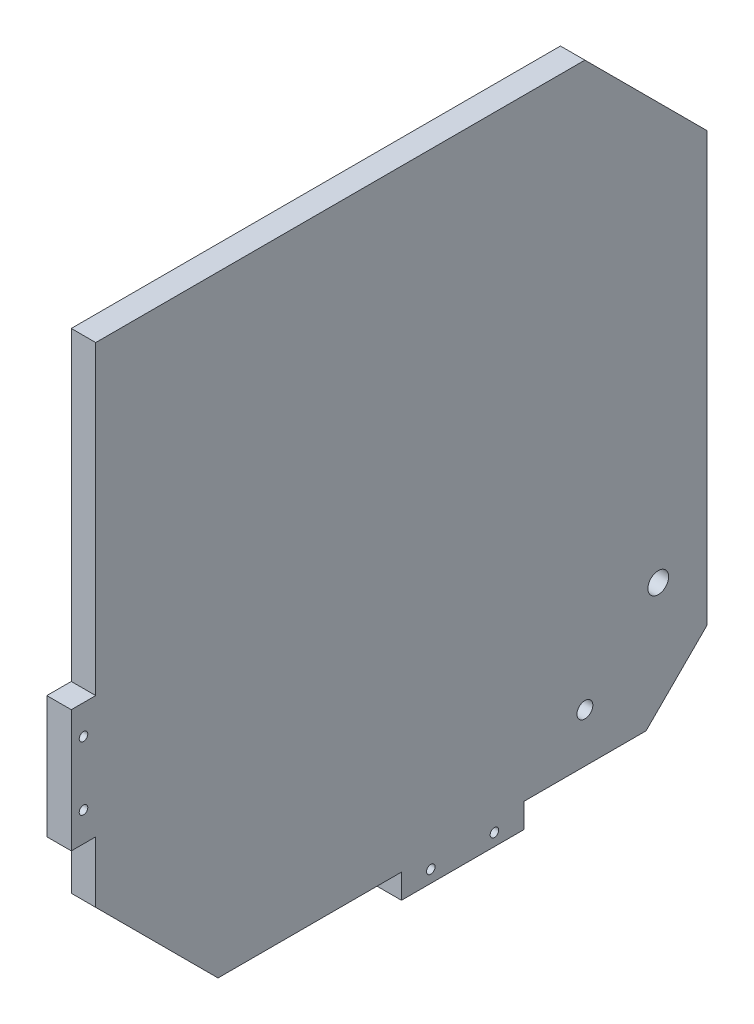
ISO-10303-21;
HEADER;
FILE_DESCRIPTION(('STEP AP214'),'2;1');
FILE_NAME('part.step','',(''),(''),'','','');
FILE_SCHEMA(('AUTOMOTIVE_DESIGN { 1 0 10303 214 1 1 1 1 }'));
ENDSEC;
DATA;
#1=APPLICATION_CONTEXT('core data for automotive mechanical design processes');
#2=APPLICATION_PROTOCOL_DEFINITION('international standard','automotive_design',2000,#1);
#3=PRODUCT_CONTEXT('',#1,'mechanical');
#4=PRODUCT('Part','Part','',(#3));
#5=PRODUCT_RELATED_PRODUCT_CATEGORY('part','',(#4));
#6=PRODUCT_DEFINITION_FORMATION('','',#4);
#7=PRODUCT_DEFINITION_CONTEXT('part definition',#1,'design');
#8=PRODUCT_DEFINITION('design','',#6,#7);
#9=PRODUCT_DEFINITION_SHAPE('','',#8);
#10=(LENGTH_UNIT() NAMED_UNIT(*) SI_UNIT(.MILLI.,.METRE.));
#11=(NAMED_UNIT(*) PLANE_ANGLE_UNIT() SI_UNIT($,.RADIAN.));
#12=(NAMED_UNIT(*) SI_UNIT($,.STERADIAN.) SOLID_ANGLE_UNIT());
#13=UNCERTAINTY_MEASURE_WITH_UNIT(LENGTH_MEASURE(1.E-05),#10,'distance_accuracy_value','');
#14=(GEOMETRIC_REPRESENTATION_CONTEXT(3) GLOBAL_UNCERTAINTY_ASSIGNED_CONTEXT((#13)) GLOBAL_UNIT_ASSIGNED_CONTEXT((#10,
#11,#12)) REPRESENTATION_CONTEXT('',''));
#15=CARTESIAN_POINT('',(0.,0.,0.));
#16=DIRECTION('',(0.,0.,1.));
#17=DIRECTION('',(1.,0.,0.));
#18=AXIS2_PLACEMENT_3D('',#15,#16,#17);
#19=CARTESIAN_POINT('',(10.,125.,0.));
#20=DIRECTION('',(-1.,0.,0.));
#21=DIRECTION('',(0.,0.,1.));
#22=AXIS2_PLACEMENT_3D('',#19,#20,#21);
#23=PLANE('',#22);
#24=CARTESIAN_POINT('',(10.,20.,-200.));
#25=DIRECTION('',(1.,0.,0.));
#26=DIRECTION('',(0.,0.,-1.));
#27=AXIS2_PLACEMENT_3D('',#24,#25,#26);
#28=CIRCLE('',#27,3.25000000000001);
#29=CARTESIAN_POINT('',(10.,20.,-203.25));
#30=VERTEX_POINT('',#29);
#31=EDGE_CURVE('E348',#30,#30,#28,.T.);
#32=ORIENTED_EDGE('',*,*,#31,.F.);
#33=EDGE_LOOP('',(#32));
#34=FACE_BOUND('',#33,.T.);
#35=CARTESIAN_POINT('',(10.,50.,-230.));
#36=DIRECTION('',(1.,0.,0.));
#37=DIRECTION('',(0.,0.,-1.));
#38=AXIS2_PLACEMENT_3D('',#35,#36,#37);
#39=CIRCLE('',#38,4.25000000000001);
#40=CARTESIAN_POINT('',(10.,50.,-234.25));
#41=VERTEX_POINT('',#40);
#42=EDGE_CURVE('E350',#41,#41,#39,.T.);
#43=ORIENTED_EDGE('',*,*,#42,.F.);
#44=EDGE_LOOP('',(#43));
#45=FACE_BOUND('',#44,.T.);
#46=CARTESIAN_POINT('',(10.,-5.,-137.));
#47=DIRECTION('',(1.,0.,0.));
#48=DIRECTION('',(0.,0.,-1.));
#49=AXIS2_PLACEMENT_3D('',#46,#47,#48);
#50=CIRCLE('',#49,1.75000000000001);
#51=CARTESIAN_POINT('',(10.,-5.,-138.75));
#52=VERTEX_POINT('',#51);
#53=EDGE_CURVE('E377',#52,#52,#50,.T.);
#54=ORIENTED_EDGE('',*,*,#53,.F.);
#55=EDGE_LOOP('',(#54));
#56=FACE_BOUND('',#55,.T.);
#57=CARTESIAN_POINT('',(10.,113.,4.99999999999998));
#58=DIRECTION('',(1.,0.,0.));
#59=DIRECTION('',(0.,0.,-1.));
#60=AXIS2_PLACEMENT_3D('',#57,#58,#59);
#61=CIRCLE('',#60,1.75);
#62=CARTESIAN_POINT('',(10.,113.,3.24999999999997));
#63=VERTEX_POINT('',#62);
#64=EDGE_CURVE('E173',#63,#63,#61,.T.);
#65=ORIENTED_EDGE('',*,*,#64,.F.);
#66=EDGE_LOOP('',(#65));
#67=FACE_BOUND('',#66,.T.);
#68=DIRECTION('',(0.,-1.,0.));
#69=VECTOR('',#68,1.);
#70=CARTESIAN_POINT('',(10.,250.,0.));
#71=LINE('',#70,#69);
#72=CARTESIAN_POINT('',(10.,250.,0.));
#73=VERTEX_POINT('',#72);
#74=CARTESIAN_POINT('',(10.,125.,0.));
#75=VERTEX_POINT('',#74);
#76=EDGE_CURVE('E198',#73,#75,#71,.T.);
#77=ORIENTED_EDGE('',*,*,#76,.T.);
#78=DIRECTION('',(0.,0.,1.));
#79=VECTOR('',#78,1.);
#80=CARTESIAN_POINT('',(10.,125.,0.));
#81=LINE('',#80,#79);
#82=CARTESIAN_POINT('',(10.,125.,9.99999999999999));
#83=VERTEX_POINT('',#82);
#84=EDGE_CURVE('E111',#75,#83,#81,.T.);
#85=ORIENTED_EDGE('',*,*,#84,.T.);
#86=DIRECTION('',(0.,-1.,0.));
#87=VECTOR('',#86,1.);
#88=CARTESIAN_POINT('',(10.,125.,9.99999999999999));
#89=LINE('',#88,#87);
#90=CARTESIAN_POINT('',(10.,75.,9.99999999999997));
#91=VERTEX_POINT('',#90);
#92=EDGE_CURVE('E234',#83,#91,#89,.T.);
#93=ORIENTED_EDGE('',*,*,#92,.T.);
#94=DIRECTION('',(0.,0.,-1.));
#95=VECTOR('',#94,1.);
#96=CARTESIAN_POINT('',(10.,75.,9.99999999999997));
#97=LINE('',#96,#95);
#98=CARTESIAN_POINT('',(10.,75.,0.));
#99=VERTEX_POINT('',#98);
#100=EDGE_CURVE('E253',#91,#99,#97,.T.);
#101=ORIENTED_EDGE('',*,*,#100,.T.);
#102=DIRECTION('',(0.,-1.,0.));
#103=VECTOR('',#102,1.);
#104=CARTESIAN_POINT('',(10.,75.,0.));
#105=LINE('',#104,#103);
#106=CARTESIAN_POINT('',(10.,50.,0.));
#107=VERTEX_POINT('',#106);
#108=EDGE_CURVE('E250',#99,#107,#105,.T.);
#109=ORIENTED_EDGE('',*,*,#108,.T.);
#110=DIRECTION('',(0.,-0.707106781186548,-0.707106781186547));
#111=VECTOR('',#110,1.);
#112=CARTESIAN_POINT('',(10.,50.,0.));
#113=LINE('',#112,#111);
#114=CARTESIAN_POINT('',(10.,0.,-50.));
#115=VERTEX_POINT('',#114);
#116=EDGE_CURVE('E252',#107,#115,#113,.T.);
#117=ORIENTED_EDGE('',*,*,#116,.T.);
#118=DIRECTION('',(0.,0.,-1.));
#119=VECTOR('',#118,1.);
#120=CARTESIAN_POINT('',(10.,0.,-50.));
#121=LINE('',#120,#119);
#122=CARTESIAN_POINT('',(10.,0.,-125.));
#123=VERTEX_POINT('',#122);
#124=EDGE_CURVE('E255',#115,#123,#121,.T.);
#125=ORIENTED_EDGE('',*,*,#124,.T.);
#126=DIRECTION('',(0.,-1.,0.));
#127=VECTOR('',#126,1.);
#128=CARTESIAN_POINT('',(10.,0.,-125.));
#129=LINE('',#128,#127);
#130=CARTESIAN_POINT('',(10.,-9.99999999999999,-125.));
#131=VERTEX_POINT('',#130);
#132=EDGE_CURVE('E261',#123,#131,#129,.T.);
#133=ORIENTED_EDGE('',*,*,#132,.T.);
#134=DIRECTION('',(0.,0.,-1.));
#135=VECTOR('',#134,1.);
#136=CARTESIAN_POINT('',(10.,-9.99999999999999,-125.));
#137=LINE('',#136,#135);
#138=CARTESIAN_POINT('',(10.,-9.99999999999999,-175.));
#139=VERTEX_POINT('',#138);
#140=EDGE_CURVE('E263',#131,#139,#137,.T.);
#141=ORIENTED_EDGE('',*,*,#140,.T.);
#142=DIRECTION('',(0.,1.,0.));
#143=VECTOR('',#142,1.);
#144=CARTESIAN_POINT('',(10.,-9.99999999999999,-175.));
#145=LINE('',#144,#143);
#146=CARTESIAN_POINT('',(10.,0.,-175.));
#147=VERTEX_POINT('',#146);
#148=EDGE_CURVE('E265',#139,#147,#145,.T.);
#149=ORIENTED_EDGE('',*,*,#148,.T.);
#150=DIRECTION('',(0.,0.,-1.));
#151=VECTOR('',#150,1.);
#152=CARTESIAN_POINT('',(10.,0.,-175.));
#153=LINE('',#152,#151);
#154=CARTESIAN_POINT('',(10.,0.,-225.));
#155=VERTEX_POINT('',#154);
#156=EDGE_CURVE('E267',#147,#155,#153,.T.);
#157=ORIENTED_EDGE('',*,*,#156,.T.);
#158=DIRECTION('',(0.,0.707106781186548,-0.707106781186547));
#159=VECTOR('',#158,1.);
#160=CARTESIAN_POINT('',(10.,25.,-250.));
#161=LINE('',#160,#159);
#162=CARTESIAN_POINT('',(10.,25.,-250.));
#163=VERTEX_POINT('',#162);
#164=EDGE_CURVE('E151',#155,#163,#161,.T.);
#165=ORIENTED_EDGE('',*,*,#164,.T.);
#166=DIRECTION('',(0.,1.,0.));
#167=VECTOR('',#166,1.);
#168=CARTESIAN_POINT('',(10.,200.,-250.));
#169=LINE('',#168,#167);
#170=CARTESIAN_POINT('',(10.,200.,-250.));
#171=VERTEX_POINT('',#170);
#172=EDGE_CURVE('E145',#163,#171,#169,.T.);
#173=ORIENTED_EDGE('',*,*,#172,.T.);
#174=DIRECTION('',(0.,0.707106781186547,0.707106781186548));
#175=VECTOR('',#174,1.);
#176=CARTESIAN_POINT('',(10.,250.,-200.));
#177=LINE('',#176,#175);
#178=CARTESIAN_POINT('',(10.,250.,-200.));
#179=VERTEX_POINT('',#178);
#180=EDGE_CURVE('E149',#171,#179,#177,.T.);
#181=ORIENTED_EDGE('',*,*,#180,.T.);
#182=DIRECTION('',(0.,0.,1.));
#183=VECTOR('',#182,1.);
#184=CARTESIAN_POINT('',(10.,250.,0.));
#185=LINE('',#184,#183);
#186=EDGE_CURVE('E47',#179,#73,#185,.T.);
#187=ORIENTED_EDGE('',*,*,#186,.T.);
#188=EDGE_LOOP('',(#77,#85,#93,#101,#109,#117,#125,#133,#141,#149,#157,#165,#173,#181,#187));
#189=FACE_BOUND('',#188,.T.);
#190=CARTESIAN_POINT('',(10.,87.,4.99999999999998));
#191=DIRECTION('',(1.,0.,0.));
#192=DIRECTION('',(0.,0.,-1.));
#193=AXIS2_PLACEMENT_3D('',#190,#191,#192);
#194=CIRCLE('',#193,1.75);
#195=CARTESIAN_POINT('',(10.,87.,3.24999999999997));
#196=VERTEX_POINT('',#195);
#197=EDGE_CURVE('E383',#196,#196,#194,.T.);
#198=ORIENTED_EDGE('',*,*,#197,.F.);
#199=EDGE_LOOP('',(#198));
#200=FACE_BOUND('',#199,.T.);
#201=CARTESIAN_POINT('',(10.,-5.,-163.));
#202=DIRECTION('',(1.,0.,0.));
#203=DIRECTION('',(0.,0.,-1.));
#204=AXIS2_PLACEMENT_3D('',#201,#202,#203);
#205=CIRCLE('',#204,1.75000000000001);
#206=CARTESIAN_POINT('',(10.,-5.,-164.75));
#207=VERTEX_POINT('',#206);
#208=EDGE_CURVE('E371',#207,#207,#205,.T.);
#209=ORIENTED_EDGE('',*,*,#208,.F.);
#210=EDGE_LOOP('',(#209));
#211=FACE_BOUND('',#210,.T.);
#212=ADVANCED_FACE('F30',(#34,#45,#56,#67,#189,#200,#211),#23,.F.);
#213=CARTESIAN_POINT('',(0.,125.,0.));
#214=DIRECTION('',(-1.,0.,0.));
#215=DIRECTION('',(0.,0.,1.));
#216=AXIS2_PLACEMENT_3D('',#213,#214,#215);
#217=PLANE('',#216);
#218=CARTESIAN_POINT('',(0.,20.,-200.));
#219=DIRECTION('',(1.,0.,0.));
#220=DIRECTION('',(0.,0.,-1.));
#221=AXIS2_PLACEMENT_3D('',#218,#219,#220);
#222=CIRCLE('',#221,3.25000000000001);
#223=CARTESIAN_POINT('',(0.,20.,-203.25));
#224=VERTEX_POINT('',#223);
#225=EDGE_CURVE('E346',#224,#224,#222,.T.);
#226=ORIENTED_EDGE('',*,*,#225,.T.);
#227=EDGE_LOOP('',(#226));
#228=FACE_BOUND('',#227,.T.);
#229=CARTESIAN_POINT('',(0.,50.,-230.));
#230=DIRECTION('',(1.,0.,0.));
#231=DIRECTION('',(0.,0.,-1.));
#232=AXIS2_PLACEMENT_3D('',#229,#230,#231);
#233=CIRCLE('',#232,4.25000000000001);
#234=CARTESIAN_POINT('',(0.,50.,-234.25));
#235=VERTEX_POINT('',#234);
#236=EDGE_CURVE('E353',#235,#235,#233,.T.);
#237=ORIENTED_EDGE('',*,*,#236,.T.);
#238=EDGE_LOOP('',(#237));
#239=FACE_BOUND('',#238,.T.);
#240=CARTESIAN_POINT('',(0.,-5.,-137.));
#241=DIRECTION('',(1.,0.,0.));
#242=DIRECTION('',(0.,0.,-1.));
#243=AXIS2_PLACEMENT_3D('',#240,#241,#242);
#244=CIRCLE('',#243,1.75000000000001);
#245=CARTESIAN_POINT('',(0.,-5.,-138.75));
#246=VERTEX_POINT('',#245);
#247=EDGE_CURVE('E374',#246,#246,#244,.T.);
#248=ORIENTED_EDGE('',*,*,#247,.T.);
#249=EDGE_LOOP('',(#248));
#250=FACE_BOUND('',#249,.T.);
#251=CARTESIAN_POINT('',(0.,113.,4.99999999999998));
#252=DIRECTION('',(1.,0.,0.));
#253=DIRECTION('',(0.,0.,-1.));
#254=AXIS2_PLACEMENT_3D('',#251,#252,#253);
#255=CIRCLE('',#254,1.75);
#256=CARTESIAN_POINT('',(0.,113.,3.24999999999997));
#257=VERTEX_POINT('',#256);
#258=EDGE_CURVE('E386',#257,#257,#255,.T.);
#259=ORIENTED_EDGE('',*,*,#258,.T.);
#260=EDGE_LOOP('',(#259));
#261=FACE_BOUND('',#260,.T.);
#262=DIRECTION('',(0.,-1.,0.));
#263=VECTOR('',#262,1.);
#264=CARTESIAN_POINT('',(0.,250.,0.));
#265=LINE('',#264,#263);
#266=CARTESIAN_POINT('',(0.,250.,0.));
#267=VERTEX_POINT('',#266);
#268=CARTESIAN_POINT('',(0.,125.,0.));
#269=VERTEX_POINT('',#268);
#270=EDGE_CURVE('E169',#267,#269,#265,.T.);
#271=ORIENTED_EDGE('',*,*,#270,.F.);
#272=DIRECTION('',(0.,0.,1.));
#273=VECTOR('',#272,1.);
#274=CARTESIAN_POINT('',(0.,250.,0.));
#275=LINE('',#274,#273);
#276=CARTESIAN_POINT('',(0.,250.,-200.));
#277=VERTEX_POINT('',#276);
#278=EDGE_CURVE('E103',#277,#267,#275,.T.);
#279=ORIENTED_EDGE('',*,*,#278,.F.);
#280=DIRECTION('',(0.,0.707106781186547,0.707106781186548));
#281=VECTOR('',#280,1.);
#282=CARTESIAN_POINT('',(0.,250.,-200.));
#283=LINE('',#282,#281);
#284=CARTESIAN_POINT('',(0.,200.,-250.));
#285=VERTEX_POINT('',#284);
#286=EDGE_CURVE('E97',#285,#277,#283,.T.);
#287=ORIENTED_EDGE('',*,*,#286,.F.);
#288=DIRECTION('',(0.,1.,0.));
#289=VECTOR('',#288,1.);
#290=CARTESIAN_POINT('',(0.,200.,-250.));
#291=LINE('',#290,#289);
#292=CARTESIAN_POINT('',(0.,25.,-250.));
#293=VERTEX_POINT('',#292);
#294=EDGE_CURVE('E159',#293,#285,#291,.T.);
#295=ORIENTED_EDGE('',*,*,#294,.F.);
#296=DIRECTION('',(0.,0.707106781186548,-0.707106781186547));
#297=VECTOR('',#296,1.);
#298=CARTESIAN_POINT('',(0.,25.,-250.));
#299=LINE('',#298,#297);
#300=CARTESIAN_POINT('',(0.,0.,-225.));
#301=VERTEX_POINT('',#300);
#302=EDGE_CURVE('E193',#301,#293,#299,.T.);
#303=ORIENTED_EDGE('',*,*,#302,.F.);
#304=DIRECTION('',(0.,0.,-1.));
#305=VECTOR('',#304,1.);
#306=CARTESIAN_POINT('',(0.,0.,-175.));
#307=LINE('',#306,#305);
#308=CARTESIAN_POINT('',(0.,0.,-175.));
#309=VERTEX_POINT('',#308);
#310=EDGE_CURVE('E191',#309,#301,#307,.T.);
#311=ORIENTED_EDGE('',*,*,#310,.F.);
#312=DIRECTION('',(0.,1.,0.));
#313=VECTOR('',#312,1.);
#314=CARTESIAN_POINT('',(0.,-9.99999999999999,-175.));
#315=LINE('',#314,#313);
#316=CARTESIAN_POINT('',(0.,-9.99999999999999,-175.));
#317=VERTEX_POINT('',#316);
#318=EDGE_CURVE('E189',#317,#309,#315,.T.);
#319=ORIENTED_EDGE('',*,*,#318,.F.);
#320=DIRECTION('',(0.,0.,-1.));
#321=VECTOR('',#320,1.);
#322=CARTESIAN_POINT('',(0.,-9.99999999999999,-125.));
#323=LINE('',#322,#321);
#324=CARTESIAN_POINT('',(0.,-9.99999999999999,-125.));
#325=VERTEX_POINT('',#324);
#326=EDGE_CURVE('E187',#325,#317,#323,.T.);
#327=ORIENTED_EDGE('',*,*,#326,.F.);
#328=DIRECTION('',(0.,-1.,0.));
#329=VECTOR('',#328,1.);
#330=CARTESIAN_POINT('',(0.,0.,-125.));
#331=LINE('',#330,#329);
#332=CARTESIAN_POINT('',(0.,0.,-125.));
#333=VERTEX_POINT('',#332);
#334=EDGE_CURVE('E185',#333,#325,#331,.T.);
#335=ORIENTED_EDGE('',*,*,#334,.F.);
#336=DIRECTION('',(0.,0.,-1.));
#337=VECTOR('',#336,1.);
#338=CARTESIAN_POINT('',(0.,0.,-50.));
#339=LINE('',#338,#337);
#340=CARTESIAN_POINT('',(0.,0.,-50.));
#341=VERTEX_POINT('',#340);
#342=EDGE_CURVE('E183',#341,#333,#339,.T.);
#343=ORIENTED_EDGE('',*,*,#342,.F.);
#344=DIRECTION('',(0.,-0.707106781186548,-0.707106781186547));
#345=VECTOR('',#344,1.);
#346=CARTESIAN_POINT('',(0.,50.,0.));
#347=LINE('',#346,#345);
#348=CARTESIAN_POINT('',(0.,50.,0.));
#349=VERTEX_POINT('',#348);
#350=EDGE_CURVE('E181',#349,#341,#347,.T.);
#351=ORIENTED_EDGE('',*,*,#350,.F.);
#352=DIRECTION('',(0.,-1.,0.));
#353=VECTOR('',#352,1.);
#354=CARTESIAN_POINT('',(0.,75.,0.));
#355=LINE('',#354,#353);
#356=CARTESIAN_POINT('',(0.,75.,0.));
#357=VERTEX_POINT('',#356);
#358=EDGE_CURVE('E179',#357,#349,#355,.T.);
#359=ORIENTED_EDGE('',*,*,#358,.F.);
#360=DIRECTION('',(0.,0.,-1.));
#361=VECTOR('',#360,1.);
#362=CARTESIAN_POINT('',(0.,75.,9.99999999999997));
#363=LINE('',#362,#361);
#364=CARTESIAN_POINT('',(0.,75.,9.99999999999997));
#365=VERTEX_POINT('',#364);
#366=EDGE_CURVE('E177',#365,#357,#363,.T.);
#367=ORIENTED_EDGE('',*,*,#366,.F.);
#368=DIRECTION('',(0.,-1.,0.));
#369=VECTOR('',#368,1.);
#370=CARTESIAN_POINT('',(0.,125.,9.99999999999999));
#371=LINE('',#370,#369);
#372=CARTESIAN_POINT('',(0.,125.,9.99999999999999));
#373=VERTEX_POINT('',#372);
#374=EDGE_CURVE('E175',#373,#365,#371,.T.);
#375=ORIENTED_EDGE('',*,*,#374,.F.);
#376=DIRECTION('',(0.,0.,1.));
#377=VECTOR('',#376,1.);
#378=CARTESIAN_POINT('',(0.,125.,0.));
#379=LINE('',#378,#377);
#380=EDGE_CURVE('E172',#269,#373,#379,.T.);
#381=ORIENTED_EDGE('',*,*,#380,.F.);
#382=EDGE_LOOP('',(#271,#279,#287,#295,#303,#311,#319,#327,#335,#343,#351,#359,#367,#375,#381));
#383=FACE_BOUND('',#382,.T.);
#384=CARTESIAN_POINT('',(0.,87.,4.99999999999998));
#385=DIRECTION('',(1.,0.,0.));
#386=DIRECTION('',(0.,0.,-1.));
#387=AXIS2_PLACEMENT_3D('',#384,#385,#386);
#388=CIRCLE('',#387,1.75);
#389=CARTESIAN_POINT('',(0.,87.,3.24999999999997));
#390=VERTEX_POINT('',#389);
#391=EDGE_CURVE('E380',#390,#390,#388,.T.);
#392=ORIENTED_EDGE('',*,*,#391,.T.);
#393=EDGE_LOOP('',(#392));
#394=FACE_BOUND('',#393,.T.);
#395=CARTESIAN_POINT('',(0.,-5.,-163.));
#396=DIRECTION('',(1.,0.,0.));
#397=DIRECTION('',(0.,0.,-1.));
#398=AXIS2_PLACEMENT_3D('',#395,#396,#397);
#399=CIRCLE('',#398,1.75000000000001);
#400=CARTESIAN_POINT('',(0.,-5.,-164.75));
#401=VERTEX_POINT('',#400);
#402=EDGE_CURVE('E368',#401,#401,#399,.T.);
#403=ORIENTED_EDGE('',*,*,#402,.T.);
#404=EDGE_LOOP('',(#403));
#405=FACE_BOUND('',#404,.T.);
#406=ADVANCED_FACE('F238',(#228,#239,#250,#261,#383,#394,#405),#217,.T.);
#407=CARTESIAN_POINT('',(10.,250.,0.));
#408=DIRECTION('',(0.,0.,-1.));
#409=DIRECTION('',(0.,1.,0.));
#410=AXIS2_PLACEMENT_3D('',#407,#408,#409);
#411=PLANE('',#410);
#412=ORIENTED_EDGE('',*,*,#270,.T.);
#413=DIRECTION('',(-1.,0.,0.));
#414=VECTOR('',#413,1.);
#415=CARTESIAN_POINT('',(10.,125.,0.));
#416=LINE('',#415,#414);
#417=EDGE_CURVE('E11',#75,#269,#416,.T.);
#418=ORIENTED_EDGE('',*,*,#417,.F.);
#419=ORIENTED_EDGE('',*,*,#76,.F.);
#420=DIRECTION('',(-1.,0.,0.));
#421=VECTOR('',#420,1.);
#422=CARTESIAN_POINT('',(10.,250.,0.));
#423=LINE('',#422,#421);
#424=EDGE_CURVE('E165',#73,#267,#423,.T.);
#425=ORIENTED_EDGE('',*,*,#424,.T.);
#426=EDGE_LOOP('',(#412,#418,#419,#425));
#427=FACE_BOUND('',#426,.T.);
#428=ADVANCED_FACE('F32',(#427),#411,.F.);
#429=CARTESIAN_POINT('',(10.,125.,0.));
#430=DIRECTION('',(0.,-1.,0.));
#431=DIRECTION('',(0.,0.,-1.));
#432=AXIS2_PLACEMENT_3D('',#429,#430,#431);
#433=PLANE('',#432);
#434=ORIENTED_EDGE('',*,*,#380,.T.);
#435=DIRECTION('',(-1.,0.,0.));
#436=VECTOR('',#435,1.);
#437=CARTESIAN_POINT('',(10.,125.,9.99999999999999));
#438=LINE('',#437,#436);
#439=EDGE_CURVE('E39',#83,#373,#438,.T.);
#440=ORIENTED_EDGE('',*,*,#439,.F.);
#441=ORIENTED_EDGE('',*,*,#84,.F.);
#442=ORIENTED_EDGE('',*,*,#417,.T.);
#443=EDGE_LOOP('',(#434,#440,#441,#442));
#444=FACE_BOUND('',#443,.T.);
#445=ADVANCED_FACE('F562',(#444),#433,.F.);
#446=CARTESIAN_POINT('',(10.,125.,9.99999999999999));
#447=DIRECTION('',(0.,0.,-1.));
#448=DIRECTION('',(0.,1.,0.));
#449=AXIS2_PLACEMENT_3D('',#446,#447,#448);
#450=PLANE('',#449);
#451=ORIENTED_EDGE('',*,*,#374,.T.);
#452=DIRECTION('',(-1.,0.,0.));
#453=VECTOR('',#452,1.);
#454=CARTESIAN_POINT('',(10.,75.,9.99999999999997));
#455=LINE('',#454,#453);
#456=EDGE_CURVE('E226',#91,#365,#455,.T.);
#457=ORIENTED_EDGE('',*,*,#456,.F.);
#458=ORIENTED_EDGE('',*,*,#92,.F.);
#459=ORIENTED_EDGE('',*,*,#439,.T.);
#460=EDGE_LOOP('',(#451,#457,#458,#459));
#461=FACE_BOUND('',#460,.T.);
#462=ADVANCED_FACE('F232',(#461),#450,.F.);
#463=CARTESIAN_POINT('',(10.,75.,9.99999999999997));
#464=DIRECTION('',(0.,1.,0.));
#465=DIRECTION('',(0.,0.,1.));
#466=AXIS2_PLACEMENT_3D('',#463,#464,#465);
#467=PLANE('',#466);
#468=ORIENTED_EDGE('',*,*,#366,.T.);
#469=DIRECTION('',(-1.,0.,0.));
#470=VECTOR('',#469,1.);
#471=CARTESIAN_POINT('',(10.,75.,0.));
#472=LINE('',#471,#470);
#473=EDGE_CURVE('E223',#99,#357,#472,.T.);
#474=ORIENTED_EDGE('',*,*,#473,.F.);
#475=ORIENTED_EDGE('',*,*,#100,.F.);
#476=ORIENTED_EDGE('',*,*,#456,.T.);
#477=EDGE_LOOP('',(#468,#474,#475,#476));
#478=FACE_BOUND('',#477,.T.);
#479=ADVANCED_FACE('F244',(#478),#467,.F.);
#480=CARTESIAN_POINT('',(10.,75.,0.));
#481=DIRECTION('',(0.,0.,-1.));
#482=DIRECTION('',(0.,1.,0.));
#483=AXIS2_PLACEMENT_3D('',#480,#481,#482);
#484=PLANE('',#483);
#485=ORIENTED_EDGE('',*,*,#358,.T.);
#486=DIRECTION('',(-1.,0.,0.));
#487=VECTOR('',#486,1.);
#488=CARTESIAN_POINT('',(10.,50.,0.));
#489=LINE('',#488,#487);
#490=EDGE_CURVE('E220',#107,#349,#489,.T.);
#491=ORIENTED_EDGE('',*,*,#490,.F.);
#492=ORIENTED_EDGE('',*,*,#108,.F.);
#493=ORIENTED_EDGE('',*,*,#473,.T.);
#494=EDGE_LOOP('',(#485,#491,#492,#493));
#495=FACE_BOUND('',#494,.T.);
#496=ADVANCED_FACE('F248',(#495),#484,.F.);
#497=CARTESIAN_POINT('',(10.,50.,0.));
#498=DIRECTION('',(0.,0.707106781186547,-0.707106781186548));
#499=DIRECTION('',(0.,0.707106781186548,0.707106781186547));
#500=AXIS2_PLACEMENT_3D('',#497,#498,#499);
#501=PLANE('',#500);
#502=ORIENTED_EDGE('',*,*,#350,.T.);
#503=DIRECTION('',(-1.,0.,0.));
#504=VECTOR('',#503,1.);
#505=CARTESIAN_POINT('',(10.,0.,-50.));
#506=LINE('',#505,#504);
#507=EDGE_CURVE('E217',#115,#341,#506,.T.);
#508=ORIENTED_EDGE('',*,*,#507,.F.);
#509=ORIENTED_EDGE('',*,*,#116,.F.);
#510=ORIENTED_EDGE('',*,*,#490,.T.);
#511=EDGE_LOOP('',(#502,#508,#509,#510));
#512=FACE_BOUND('',#511,.T.);
#513=ADVANCED_FACE('F527',(#512),#501,.F.);
#514=CARTESIAN_POINT('',(10.,0.,-50.));
#515=DIRECTION('',(0.,1.,0.));
#516=DIRECTION('',(0.,0.,1.));
#517=AXIS2_PLACEMENT_3D('',#514,#515,#516);
#518=PLANE('',#517);
#519=ORIENTED_EDGE('',*,*,#342,.T.);
#520=DIRECTION('',(-1.,0.,0.));
#521=VECTOR('',#520,1.);
#522=CARTESIAN_POINT('',(10.,0.,-125.));
#523=LINE('',#522,#521);
#524=EDGE_CURVE('E214',#123,#333,#523,.T.);
#525=ORIENTED_EDGE('',*,*,#524,.F.);
#526=ORIENTED_EDGE('',*,*,#124,.F.);
#527=ORIENTED_EDGE('',*,*,#507,.T.);
#528=EDGE_LOOP('',(#519,#525,#526,#527));
#529=FACE_BOUND('',#528,.T.);
#530=ADVANCED_FACE('F517',(#529),#518,.F.);
#531=CARTESIAN_POINT('',(10.,0.,-125.));
#532=DIRECTION('',(0.,0.,-1.));
#533=DIRECTION('',(-1.,0.,0.));
#534=AXIS2_PLACEMENT_3D('',#531,#532,#533);
#535=PLANE('',#534);
#536=ORIENTED_EDGE('',*,*,#334,.T.);
#537=DIRECTION('',(-1.,0.,0.));
#538=VECTOR('',#537,1.);
#539=CARTESIAN_POINT('',(10.,-9.99999999999999,-125.));
#540=LINE('',#539,#538);
#541=EDGE_CURVE('E211',#131,#325,#540,.T.);
#542=ORIENTED_EDGE('',*,*,#541,.F.);
#543=ORIENTED_EDGE('',*,*,#132,.F.);
#544=ORIENTED_EDGE('',*,*,#524,.T.);
#545=EDGE_LOOP('',(#536,#542,#543,#544));
#546=FACE_BOUND('',#545,.T.);
#547=ADVANCED_FACE('F507',(#546),#535,.F.);
#548=CARTESIAN_POINT('',(10.,-9.99999999999999,-125.));
#549=DIRECTION('',(0.,1.,0.));
#550=DIRECTION('',(0.,0.,1.));
#551=AXIS2_PLACEMENT_3D('',#548,#549,#550);
#552=PLANE('',#551);
#553=ORIENTED_EDGE('',*,*,#326,.T.);
#554=DIRECTION('',(-1.,0.,0.));
#555=VECTOR('',#554,1.);
#556=CARTESIAN_POINT('',(10.,-9.99999999999999,-175.));
#557=LINE('',#556,#555);
#558=EDGE_CURVE('E208',#139,#317,#557,.T.);
#559=ORIENTED_EDGE('',*,*,#558,.F.);
#560=ORIENTED_EDGE('',*,*,#140,.F.);
#561=ORIENTED_EDGE('',*,*,#541,.T.);
#562=EDGE_LOOP('',(#553,#559,#560,#561));
#563=FACE_BOUND('',#562,.T.);
#564=ADVANCED_FACE('F497',(#563),#552,.F.);
#565=CARTESIAN_POINT('',(10.,-9.99999999999999,-175.));
#566=DIRECTION('',(0.,0.,1.));
#567=DIRECTION('',(1.,0.,0.));
#568=AXIS2_PLACEMENT_3D('',#565,#566,#567);
#569=PLANE('',#568);
#570=ORIENTED_EDGE('',*,*,#318,.T.);
#571=DIRECTION('',(-1.,0.,0.));
#572=VECTOR('',#571,1.);
#573=CARTESIAN_POINT('',(10.,0.,-175.));
#574=LINE('',#573,#572);
#575=EDGE_CURVE('E205',#147,#309,#574,.T.);
#576=ORIENTED_EDGE('',*,*,#575,.F.);
#577=ORIENTED_EDGE('',*,*,#148,.F.);
#578=ORIENTED_EDGE('',*,*,#558,.T.);
#579=EDGE_LOOP('',(#570,#576,#577,#578));
#580=FACE_BOUND('',#579,.T.);
#581=ADVANCED_FACE('F488',(#580),#569,.F.);
#582=CARTESIAN_POINT('',(10.,0.,-175.));
#583=DIRECTION('',(0.,1.,0.));
#584=DIRECTION('',(0.,0.,1.));
#585=AXIS2_PLACEMENT_3D('',#582,#583,#584);
#586=PLANE('',#585);
#587=ORIENTED_EDGE('',*,*,#310,.T.);
#588=DIRECTION('',(-1.,0.,0.));
#589=VECTOR('',#588,1.);
#590=CARTESIAN_POINT('',(10.,0.,-225.));
#591=LINE('',#590,#589);
#592=EDGE_CURVE('E202',#155,#301,#591,.T.);
#593=ORIENTED_EDGE('',*,*,#592,.F.);
#594=ORIENTED_EDGE('',*,*,#156,.F.);
#595=ORIENTED_EDGE('',*,*,#575,.T.);
#596=EDGE_LOOP('',(#587,#593,#594,#595));
#597=FACE_BOUND('',#596,.T.);
#598=ADVANCED_FACE('F273',(#597),#586,.F.);
#599=CARTESIAN_POINT('',(10.,25.,-250.));
#600=DIRECTION('',(0.,0.707106781186547,0.707106781186548));
#601=DIRECTION('',(0.,-0.707106781186548,0.707106781186547));
#602=AXIS2_PLACEMENT_3D('',#599,#600,#601);
#603=PLANE('',#602);
#604=ORIENTED_EDGE('',*,*,#302,.T.);
#605=DIRECTION('',(-1.,0.,0.));
#606=VECTOR('',#605,1.);
#607=CARTESIAN_POINT('',(10.,25.,-250.));
#608=LINE('',#607,#606);
#609=EDGE_CURVE('E160',#163,#293,#608,.T.);
#610=ORIENTED_EDGE('',*,*,#609,.F.);
#611=ORIENTED_EDGE('',*,*,#164,.F.);
#612=ORIENTED_EDGE('',*,*,#592,.T.);
#613=EDGE_LOOP('',(#604,#610,#611,#612));
#614=FACE_BOUND('',#613,.T.);
#615=ADVANCED_FACE('F277',(#614),#603,.F.);
#616=CARTESIAN_POINT('',(10.,200.,-250.));
#617=DIRECTION('',(0.,0.,1.));
#618=DIRECTION('',(0.,-1.,0.));
#619=AXIS2_PLACEMENT_3D('',#616,#617,#618);
#620=PLANE('',#619);
#621=ORIENTED_EDGE('',*,*,#294,.T.);
#622=DIRECTION('',(-1.,0.,0.));
#623=VECTOR('',#622,1.);
#624=CARTESIAN_POINT('',(10.,200.,-250.));
#625=LINE('',#624,#623);
#626=EDGE_CURVE('E156',#171,#285,#625,.T.);
#627=ORIENTED_EDGE('',*,*,#626,.F.);
#628=ORIENTED_EDGE('',*,*,#172,.F.);
#629=ORIENTED_EDGE('',*,*,#609,.T.);
#630=EDGE_LOOP('',(#621,#627,#628,#629));
#631=FACE_BOUND('',#630,.T.);
#632=ADVANCED_FACE('F157',(#631),#620,.F.);
#633=CARTESIAN_POINT('',(10.,250.,-200.));
#634=DIRECTION('',(0.,-0.707106781186548,0.707106781186547));
#635=DIRECTION('',(0.,-0.707106781186547,-0.707106781186548));
#636=AXIS2_PLACEMENT_3D('',#633,#634,#635);
#637=PLANE('',#636);
#638=CARTESIAN_POINT('',(5.,242.928932188135,-207.071067811866));
#639=DIRECTION('',(0.,0.707106781186548,-0.707106781186547));
#640=DIRECTION('',(0.,0.707106781186547,0.707106781186548));
#641=AXIS2_PLACEMENT_3D('',#638,#639,#640);
#642=CIRCLE('',#641,1.5);
#643=CARTESIAN_POINT('',(5.,243.989592359914,-206.010407640086));
#644=VERTEX_POINT('',#643);
#645=EDGE_CURVE('E356',#644,#644,#642,.T.);
#646=ORIENTED_EDGE('',*,*,#645,.F.);
#647=EDGE_LOOP('',(#646));
#648=FACE_BOUND('',#647,.T.);
#649=CARTESIAN_POINT('',(5.,221.715728752538,-228.284271247462));
#650=DIRECTION('',(0.,0.707106781186548,-0.707106781186547));
#651=DIRECTION('',(0.,0.707106781186547,0.707106781186548));
#652=AXIS2_PLACEMENT_3D('',#649,#650,#651);
#653=CIRCLE('',#652,1.5);
#654=CARTESIAN_POINT('',(5.,222.776388924318,-227.223611075682));
#655=VERTEX_POINT('',#654);
#656=EDGE_CURVE('E362',#655,#655,#653,.T.);
#657=ORIENTED_EDGE('',*,*,#656,.F.);
#658=EDGE_LOOP('',(#657));
#659=FACE_BOUND('',#658,.T.);
#660=ORIENTED_EDGE('',*,*,#286,.T.);
#661=DIRECTION('',(-1.,0.,0.));
#662=VECTOR('',#661,1.);
#663=CARTESIAN_POINT('',(10.,250.,-200.));
#664=LINE('',#663,#662);
#665=EDGE_CURVE('E161',#179,#277,#664,.T.);
#666=ORIENTED_EDGE('',*,*,#665,.F.);
#667=ORIENTED_EDGE('',*,*,#180,.F.);
#668=ORIENTED_EDGE('',*,*,#626,.T.);
#669=EDGE_LOOP('',(#660,#666,#667,#668));
#670=FACE_BOUND('',#669,.T.);
#671=ADVANCED_FACE('F163',(#648,#659,#670),#637,.F.);
#672=CARTESIAN_POINT('',(10.,250.,0.));
#673=DIRECTION('',(0.,-1.,0.));
#674=DIRECTION('',(0.,0.,-1.));
#675=AXIS2_PLACEMENT_3D('',#672,#673,#674);
#676=PLANE('',#675);
#677=ORIENTED_EDGE('',*,*,#278,.T.);
#678=ORIENTED_EDGE('',*,*,#424,.F.);
#679=ORIENTED_EDGE('',*,*,#186,.F.);
#680=ORIENTED_EDGE('',*,*,#665,.T.);
#681=EDGE_LOOP('',(#677,#678,#679,#680));
#682=FACE_BOUND('',#681,.T.);
#683=ADVANCED_FACE('F281',(#682),#676,.F.);
#684=CARTESIAN_POINT('',(10.,113.,4.99999999999998));
#685=DIRECTION('',(-1.,0.,0.));
#686=DIRECTION('',(0.,0.,1.));
#687=AXIS2_PLACEMENT_3D('',#684,#685,#686);
#688=CYLINDRICAL_SURFACE('',#687,1.75);
#689=ORIENTED_EDGE('',*,*,#64,.T.);
#690=EDGE_LOOP('',(#689));
#691=FACE_BOUND('',#690,.T.);
#692=ORIENTED_EDGE('',*,*,#258,.F.);
#693=EDGE_LOOP('',(#692));
#694=FACE_BOUND('',#693,.T.);
#695=ADVANCED_FACE('F283',(#691,#694),#688,.F.);
#696=CARTESIAN_POINT('',(10.,87.,4.99999999999998));
#697=DIRECTION('',(-1.,0.,0.));
#698=DIRECTION('',(0.,0.,1.));
#699=AXIS2_PLACEMENT_3D('',#696,#697,#698);
#700=CYLINDRICAL_SURFACE('',#699,1.75);
#701=ORIENTED_EDGE('',*,*,#197,.T.);
#702=EDGE_LOOP('',(#701));
#703=FACE_BOUND('',#702,.T.);
#704=ORIENTED_EDGE('',*,*,#391,.F.);
#705=EDGE_LOOP('',(#704));
#706=FACE_BOUND('',#705,.T.);
#707=ADVANCED_FACE('F289',(#703,#706),#700,.F.);
#708=CARTESIAN_POINT('',(10.,-5.,-137.));
#709=DIRECTION('',(-1.,0.,0.));
#710=DIRECTION('',(0.,0.,1.));
#711=AXIS2_PLACEMENT_3D('',#708,#709,#710);
#712=CYLINDRICAL_SURFACE('',#711,1.75000000000001);
#713=ORIENTED_EDGE('',*,*,#53,.T.);
#714=EDGE_LOOP('',(#713));
#715=FACE_BOUND('',#714,.T.);
#716=ORIENTED_EDGE('',*,*,#247,.F.);
#717=EDGE_LOOP('',(#716));
#718=FACE_BOUND('',#717,.T.);
#719=ADVANCED_FACE('F309',(#715,#718),#712,.F.);
#720=CARTESIAN_POINT('',(10.,-5.,-163.));
#721=DIRECTION('',(-1.,0.,0.));
#722=DIRECTION('',(0.,0.,1.));
#723=AXIS2_PLACEMENT_3D('',#720,#721,#722);
#724=CYLINDRICAL_SURFACE('',#723,1.75000000000001);
#725=ORIENTED_EDGE('',*,*,#208,.T.);
#726=EDGE_LOOP('',(#725));
#727=FACE_BOUND('',#726,.T.);
#728=ORIENTED_EDGE('',*,*,#402,.F.);
#729=EDGE_LOOP('',(#728));
#730=FACE_BOUND('',#729,.T.);
#731=ADVANCED_FACE('F313',(#727,#730),#724,.F.);
#732=CARTESIAN_POINT('',(5.,211.10912703474,-217.677669529664));
#733=DIRECTION('',(0.,0.707106781186548,-0.707106781186547));
#734=DIRECTION('',(0.,0.707106781186547,0.707106781186548));
#735=AXIS2_PLACEMENT_3D('',#732,#733,#734);
#736=CYLINDRICAL_SURFACE('',#735,1.5);
#737=CARTESIAN_POINT('',(5.,211.10912703474,-217.677669529664));
#738=DIRECTION('',(0.,0.707106781186548,-0.707106781186547));
#739=DIRECTION('',(0.,0.707106781186547,0.707106781186548));
#740=AXIS2_PLACEMENT_3D('',#737,#738,#739);
#741=CIRCLE('',#740,1.5);
#742=CARTESIAN_POINT('',(5.,212.16978720652,-216.617009357884));
#743=VERTEX_POINT('',#742);
#744=EDGE_CURVE('E365',#743,#743,#741,.T.);
#745=ORIENTED_EDGE('',*,*,#744,.F.);
#746=EDGE_LOOP('',(#745));
#747=FACE_BOUND('',#746,.T.);
#748=ORIENTED_EDGE('',*,*,#656,.T.);
#749=EDGE_LOOP('',(#748));
#750=FACE_BOUND('',#749,.T.);
#751=ADVANCED_FACE('F317',(#747,#750),#736,.F.);
#752=CARTESIAN_POINT('',(5.,211.10912703474,-217.677669529664));
#753=DIRECTION('',(0.,0.707106781186548,-0.707106781186547));
#754=DIRECTION('',(0.,0.707106781186547,0.707106781186548));
#755=AXIS2_PLACEMENT_3D('',#752,#753,#754);
#756=PLANE('',#755);
#757=ORIENTED_EDGE('',*,*,#744,.T.);
#758=EDGE_LOOP('',(#757));
#759=FACE_BOUND('',#758,.T.);
#760=ADVANCED_FACE('F321',(#759),#756,.T.);
#761=CARTESIAN_POINT('',(5.,232.322330470336,-196.464466094067));
#762=DIRECTION('',(0.,0.707106781186548,-0.707106781186547));
#763=DIRECTION('',(0.,0.707106781186547,0.707106781186548));
#764=AXIS2_PLACEMENT_3D('',#761,#762,#763);
#765=CYLINDRICAL_SURFACE('',#764,1.5);
#766=CARTESIAN_POINT('',(5.,232.322330470336,-196.464466094067));
#767=DIRECTION('',(0.,0.707106781186548,-0.707106781186547));
#768=DIRECTION('',(0.,0.707106781186547,0.707106781186548));
#769=AXIS2_PLACEMENT_3D('',#766,#767,#768);
#770=CIRCLE('',#769,1.5);
#771=CARTESIAN_POINT('',(5.,233.382990642116,-195.403805922288));
#772=VERTEX_POINT('',#771);
#773=EDGE_CURVE('E359',#772,#772,#770,.T.);
#774=ORIENTED_EDGE('',*,*,#773,.F.);
#775=EDGE_LOOP('',(#774));
#776=FACE_BOUND('',#775,.T.);
#777=ORIENTED_EDGE('',*,*,#645,.T.);
#778=EDGE_LOOP('',(#777));
#779=FACE_BOUND('',#778,.T.);
#780=ADVANCED_FACE('F325',(#776,#779),#765,.F.);
#781=CARTESIAN_POINT('',(5.,232.322330470336,-196.464466094067));
#782=DIRECTION('',(0.,0.707106781186548,-0.707106781186547));
#783=DIRECTION('',(0.,0.707106781186547,0.707106781186548));
#784=AXIS2_PLACEMENT_3D('',#781,#782,#783);
#785=PLANE('',#784);
#786=ORIENTED_EDGE('',*,*,#773,.T.);
#787=EDGE_LOOP('',(#786));
#788=FACE_BOUND('',#787,.T.);
#789=ADVANCED_FACE('F329',(#788),#785,.T.);
#790=CARTESIAN_POINT('',(0.,50.,-230.));
#791=DIRECTION('',(1.,0.,0.));
#792=DIRECTION('',(0.,0.,-1.));
#793=AXIS2_PLACEMENT_3D('',#790,#791,#792);
#794=CYLINDRICAL_SURFACE('',#793,4.25000000000001);
#795=ORIENTED_EDGE('',*,*,#236,.F.);
#796=EDGE_LOOP('',(#795));
#797=FACE_BOUND('',#796,.T.);
#798=ORIENTED_EDGE('',*,*,#42,.T.);
#799=EDGE_LOOP('',(#798));
#800=FACE_BOUND('',#799,.T.);
#801=ADVANCED_FACE('F333',(#797,#800),#794,.F.);
#802=CARTESIAN_POINT('',(0.,20.,-200.));
#803=DIRECTION('',(1.,0.,0.));
#804=DIRECTION('',(0.,0.,-1.));
#805=AXIS2_PLACEMENT_3D('',#802,#803,#804);
#806=CYLINDRICAL_SURFACE('',#805,3.25000000000001);
#807=ORIENTED_EDGE('',*,*,#225,.F.);
#808=EDGE_LOOP('',(#807));
#809=FACE_BOUND('',#808,.T.);
#810=ORIENTED_EDGE('',*,*,#31,.T.);
#811=EDGE_LOOP('',(#810));
#812=FACE_BOUND('',#811,.T.);
#813=ADVANCED_FACE('F337',(#809,#812),#806,.F.);
#814=CLOSED_SHELL('',(#212,#406,#428,#445,#462,#479,#496,#513,#530,#547,#564,#581,#598,#615,
#632,#671,#683,#695,#707,#719,#731,#751,#760,#780,#789,#801,#813));
#815=MANIFOLD_SOLID_BREP('B2',#814);
#816=ADVANCED_BREP_SHAPE_REPRESENTATION('',(#18,#815),#14);
#817=SHAPE_DEFINITION_REPRESENTATION(#9,#816);
ENDSEC;
END-ISO-10303-21;
